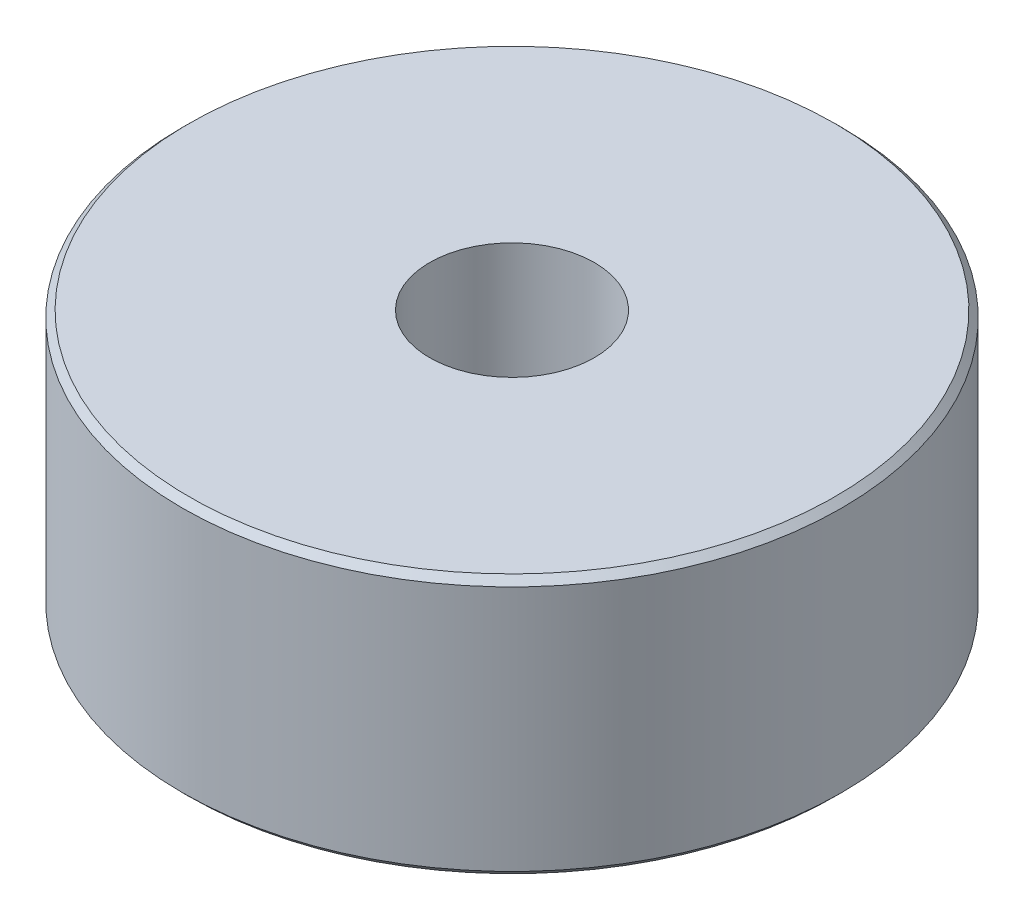
ISO-10303-21;
HEADER;
FILE_DESCRIPTION(('STEP AP214'),'2;1');
FILE_NAME('part.step','',(''),(''),'','','');
FILE_SCHEMA(('AUTOMOTIVE_DESIGN { 1 0 10303 214 1 1 1 1 }'));
ENDSEC;
DATA;
#1=APPLICATION_CONTEXT('core data for automotive mechanical design processes');
#2=APPLICATION_PROTOCOL_DEFINITION('international standard','automotive_design',2000,#1);
#3=PRODUCT_CONTEXT('',#1,'mechanical');
#4=PRODUCT('Part','Part','',(#3));
#5=PRODUCT_RELATED_PRODUCT_CATEGORY('part','',(#4));
#6=PRODUCT_DEFINITION_FORMATION('','',#4);
#7=PRODUCT_DEFINITION_CONTEXT('part definition',#1,'design');
#8=PRODUCT_DEFINITION('design','',#6,#7);
#9=PRODUCT_DEFINITION_SHAPE('','',#8);
#10=(LENGTH_UNIT() NAMED_UNIT(*) SI_UNIT(.MILLI.,.METRE.));
#11=(NAMED_UNIT(*) PLANE_ANGLE_UNIT() SI_UNIT($,.RADIAN.));
#12=(NAMED_UNIT(*) SI_UNIT($,.STERADIAN.) SOLID_ANGLE_UNIT());
#13=UNCERTAINTY_MEASURE_WITH_UNIT(LENGTH_MEASURE(1.E-05),#10,'distance_accuracy_value','');
#14=(GEOMETRIC_REPRESENTATION_CONTEXT(3) GLOBAL_UNCERTAINTY_ASSIGNED_CONTEXT((#13)) GLOBAL_UNIT_ASSIGNED_CONTEXT((#10,
#11,#12)) REPRESENTATION_CONTEXT('',''));
#15=CARTESIAN_POINT('',(0.,0.,0.));
#16=DIRECTION('',(0.,0.,1.));
#17=DIRECTION('',(1.,0.,0.));
#18=AXIS2_PLACEMENT_3D('',#15,#16,#17);
#19=CARTESIAN_POINT('',(0.,2.37299999992047,0.));
#20=DIRECTION('',(0.,-1.,0.));
#21=DIRECTION('',(0.,0.,-1.));
#22=AXIS2_PLACEMENT_3D('',#19,#20,#21);
#23=CONICAL_SURFACE('',#22,6.35000000005448,0.785398163397448);
#24=CARTESIAN_POINT('',(0.,2.373,0.));
#25=DIRECTION('',(0.,-1.,0.));
#26=DIRECTION('',(0.,0.,-1.));
#27=AXIS2_PLACEMENT_3D('',#24,#25,#26);
#28=CIRCLE('',#27,6.35);
#29=CARTESIAN_POINT('',(0.,2.373,-6.35));
#30=VERTEX_POINT('',#29);
#31=EDGE_CURVE('E31',#30,#30,#28,.T.);
#32=ORIENTED_EDGE('',*,*,#31,.F.);
#33=EDGE_LOOP('',(#32));
#34=FACE_BOUND('',#33,.T.);
#35=CARTESIAN_POINT('',(0.,2.49999999999773,0.));
#36=DIRECTION('',(0.,-1.,0.));
#37=DIRECTION('',(0.,0.,-1.));
#38=AXIS2_PLACEMENT_3D('',#35,#36,#37);
#39=CIRCLE('',#38,6.22299999997722);
#40=CARTESIAN_POINT('',(0.,2.49999999999773,-6.22299999997722));
#41=VERTEX_POINT('',#40);
#42=EDGE_CURVE('E19',#41,#41,#39,.F.);
#43=ORIENTED_EDGE('',*,*,#42,.F.);
#44=EDGE_LOOP('',(#43));
#45=FACE_BOUND('',#44,.T.);
#46=ADVANCED_FACE('F16',(#34,#45),#23,.T.);
#47=CARTESIAN_POINT('',(0.,2.5,0.));
#48=DIRECTION('',(0.,-1.,0.));
#49=DIRECTION('',(0.,0.,-1.));
#50=AXIS2_PLACEMENT_3D('',#47,#48,#49);
#51=CYLINDRICAL_SURFACE('',#50,6.35);
#52=ORIENTED_EDGE('',*,*,#31,.T.);
#53=EDGE_LOOP('',(#52));
#54=FACE_BOUND('',#53,.T.);
#55=CARTESIAN_POINT('',(0.,-2.37299999997731,0.));
#56=DIRECTION('',(0.,1.,0.));
#57=DIRECTION('',(0.,0.,1.));
#58=AXIS2_PLACEMENT_3D('',#55,#56,#57);
#59=CIRCLE('',#58,6.34999999999764);
#60=CARTESIAN_POINT('',(0.,-2.37299999997731,6.34999999999764));
#61=VERTEX_POINT('',#60);
#62=EDGE_CURVE('E34',#61,#61,#59,.F.);
#63=ORIENTED_EDGE('',*,*,#62,.F.);
#64=EDGE_LOOP('',(#63));
#65=FACE_BOUND('',#64,.T.);
#66=ADVANCED_FACE('F46',(#54,#65),#51,.T.);
#67=CARTESIAN_POINT('',(0.,2.5,0.));
#68=DIRECTION('',(0.,1.,0.));
#69=DIRECTION('',(0.,0.,1.));
#70=AXIS2_PLACEMENT_3D('',#67,#68,#69);
#71=PLANE('',#70);
#72=CARTESIAN_POINT('',(0.,2.5,0.));
#73=DIRECTION('',(0.,-1.,0.));
#74=DIRECTION('',(0.,0.,-1.));
#75=AXIS2_PLACEMENT_3D('',#72,#73,#74);
#76=CIRCLE('',#75,1.5875);
#77=CARTESIAN_POINT('',(0.,2.5,-1.5875));
#78=VERTEX_POINT('',#77);
#79=EDGE_CURVE('E28',#78,#78,#76,.T.);
#80=ORIENTED_EDGE('',*,*,#79,.T.);
#81=EDGE_LOOP('',(#80));
#82=FACE_BOUND('',#81,.T.);
#83=ORIENTED_EDGE('',*,*,#42,.T.);
#84=EDGE_LOOP('',(#83));
#85=FACE_BOUND('',#84,.T.);
#86=ADVANCED_FACE('F54',(#82,#85),#71,.T.);
#87=CARTESIAN_POINT('',(0.,-2.37300000003415,0.));
#88=DIRECTION('',(0.,1.,0.));
#89=DIRECTION('',(0.,0.,1.));
#90=AXIS2_PLACEMENT_3D('',#87,#88,#89);
#91=CONICAL_SURFACE('',#90,6.34999999994079,0.785398163397448);
#92=CARTESIAN_POINT('',(0.,-2.49999999999773,0.));
#93=DIRECTION('',(0.,1.,0.));
#94=DIRECTION('',(0.,0.,1.));
#95=AXIS2_PLACEMENT_3D('',#92,#93,#94);
#96=CIRCLE('',#95,6.22299999997722);
#97=CARTESIAN_POINT('',(0.,-2.49999999999773,6.22299999997722));
#98=VERTEX_POINT('',#97);
#99=EDGE_CURVE('E23',#98,#98,#96,.T.);
#100=ORIENTED_EDGE('',*,*,#99,.T.);
#101=EDGE_LOOP('',(#100));
#102=FACE_BOUND('',#101,.T.);
#103=ORIENTED_EDGE('',*,*,#62,.T.);
#104=EDGE_LOOP('',(#103));
#105=FACE_BOUND('',#104,.T.);
#106=ADVANCED_FACE('F63',(#102,#105),#91,.T.);
#107=CARTESIAN_POINT('',(0.,2.5,0.));
#108=DIRECTION('',(0.,-1.,0.));
#109=DIRECTION('',(0.,0.,-1.));
#110=AXIS2_PLACEMENT_3D('',#107,#108,#109);
#111=CYLINDRICAL_SURFACE('',#110,1.5875);
#112=CARTESIAN_POINT('',(0.,-2.5,0.));
#113=DIRECTION('',(0.,-1.,0.));
#114=DIRECTION('',(0.,0.,-1.));
#115=AXIS2_PLACEMENT_3D('',#112,#113,#114);
#116=CIRCLE('',#115,1.5875);
#117=CARTESIAN_POINT('',(0.,-2.5,-1.5875));
#118=VERTEX_POINT('',#117);
#119=EDGE_CURVE('E10',#118,#118,#116,.T.);
#120=ORIENTED_EDGE('',*,*,#119,.T.);
#121=EDGE_LOOP('',(#120));
#122=FACE_BOUND('',#121,.T.);
#123=ORIENTED_EDGE('',*,*,#79,.F.);
#124=EDGE_LOOP('',(#123));
#125=FACE_BOUND('',#124,.T.);
#126=ADVANCED_FACE('F57',(#122,#125),#111,.F.);
#127=CARTESIAN_POINT('',(0.,-2.5,0.));
#128=DIRECTION('',(0.,1.,0.));
#129=DIRECTION('',(0.,0.,1.));
#130=AXIS2_PLACEMENT_3D('',#127,#128,#129);
#131=PLANE('',#130);
#132=ORIENTED_EDGE('',*,*,#119,.F.);
#133=EDGE_LOOP('',(#132));
#134=FACE_BOUND('',#133,.T.);
#135=ORIENTED_EDGE('',*,*,#99,.F.);
#136=EDGE_LOOP('',(#135));
#137=FACE_BOUND('',#136,.T.);
#138=ADVANCED_FACE('F55',(#134,#137),#131,.F.);
#139=CLOSED_SHELL('',(#46,#66,#86,#106,#126,#138));
#140=MANIFOLD_SOLID_BREP('B1',#139);
#141=ADVANCED_BREP_SHAPE_REPRESENTATION('',(#18,#140),#14);
#142=SHAPE_DEFINITION_REPRESENTATION(#9,#141);
ENDSEC;
END-ISO-10303-21;
